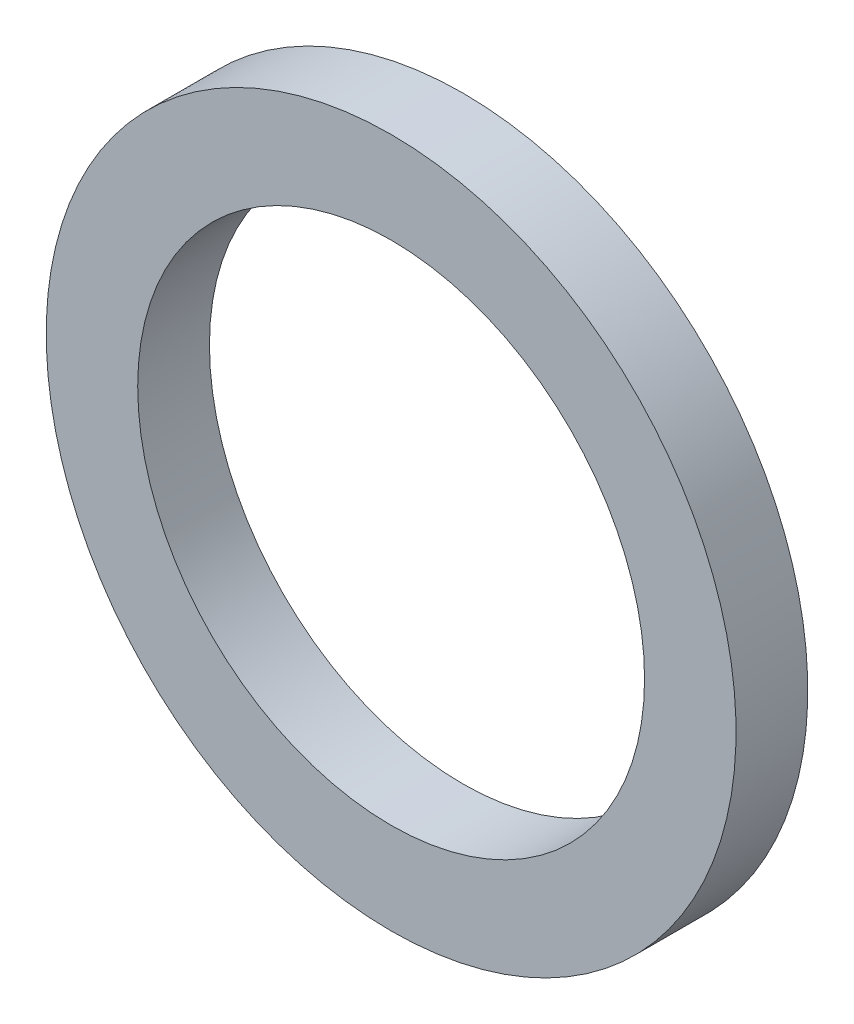
ISO-10303-21;
HEADER;
FILE_DESCRIPTION(('STEP AP214'),'2;1');
FILE_NAME('part.step','',(''),(''),'','','');
FILE_SCHEMA(('AUTOMOTIVE_DESIGN { 1 0 10303 214 1 1 1 1 }'));
ENDSEC;
DATA;
#1=APPLICATION_CONTEXT('core data for automotive mechanical design processes');
#2=APPLICATION_PROTOCOL_DEFINITION('international standard','automotive_design',2000,#1);
#3=PRODUCT_CONTEXT('',#1,'mechanical');
#4=PRODUCT('Part','Part','',(#3));
#5=PRODUCT_RELATED_PRODUCT_CATEGORY('part','',(#4));
#6=PRODUCT_DEFINITION_FORMATION('','',#4);
#7=PRODUCT_DEFINITION_CONTEXT('part definition',#1,'design');
#8=PRODUCT_DEFINITION('design','',#6,#7);
#9=PRODUCT_DEFINITION_SHAPE('','',#8);
#10=(LENGTH_UNIT() NAMED_UNIT(*) SI_UNIT(.MILLI.,.METRE.));
#11=(NAMED_UNIT(*) PLANE_ANGLE_UNIT() SI_UNIT($,.RADIAN.));
#12=(NAMED_UNIT(*) SI_UNIT($,.STERADIAN.) SOLID_ANGLE_UNIT());
#13=UNCERTAINTY_MEASURE_WITH_UNIT(LENGTH_MEASURE(1.E-05),#10,'distance_accuracy_value','');
#14=(GEOMETRIC_REPRESENTATION_CONTEXT(3) GLOBAL_UNCERTAINTY_ASSIGNED_CONTEXT((#13)) GLOBAL_UNIT_ASSIGNED_CONTEXT((#10,
#11,#12)) REPRESENTATION_CONTEXT('',''));
#15=CARTESIAN_POINT('',(0.,0.,0.));
#16=DIRECTION('',(0.,0.,1.));
#17=DIRECTION('',(1.,0.,0.));
#18=AXIS2_PLACEMENT_3D('',#15,#16,#17);
#19=CARTESIAN_POINT('',(0.,0.,2.4906));
#20=DIRECTION('',(0.,0.,-1.));
#21=DIRECTION('',(0.,1.,0.));
#22=AXIS2_PLACEMENT_3D('',#19,#20,#21);
#23=PLANE('',#22);
#24=CARTESIAN_POINT('',(0.,0.,2.4906));
#25=DIRECTION('',(0.,0.,1.));
#26=DIRECTION('',(0.,-1.,0.));
#27=AXIS2_PLACEMENT_3D('',#24,#25,#26);
#28=CIRCLE('',#27,3.125);
#29=CARTESIAN_POINT('',(0.,-3.125,2.4906));
#30=VERTEX_POINT('',#29);
#31=EDGE_CURVE('E26',#30,#30,#28,.T.);
#32=ORIENTED_EDGE('',*,*,#31,.F.);
#33=EDGE_LOOP('',(#32));
#34=FACE_BOUND('',#33,.T.);
#35=CARTESIAN_POINT('',(0.,0.,2.4906));
#36=DIRECTION('',(0.,0.,-1.));
#37=DIRECTION('',(0.,1.,0.));
#38=AXIS2_PLACEMENT_3D('',#35,#36,#37);
#39=CIRCLE('',#38,2.29616);
#40=CARTESIAN_POINT('',(0.,2.29616,2.4906));
#41=VERTEX_POINT('',#40);
#42=EDGE_CURVE('E35',#41,#41,#39,.F.);
#43=ORIENTED_EDGE('',*,*,#42,.T.);
#44=EDGE_LOOP('',(#43));
#45=FACE_BOUND('',#44,.T.);
#46=ADVANCED_FACE('F23',(#34,#45),#23,.T.);
#47=CARTESIAN_POINT('',(0.,0.,2.4906));
#48=DIRECTION('',(0.,0.,1.));
#49=DIRECTION('',(0.,-1.,0.));
#50=AXIS2_PLACEMENT_3D('',#47,#48,#49);
#51=CYLINDRICAL_SURFACE('',#50,3.125);
#52=CARTESIAN_POINT('',(0.,0.,3.1406));
#53=DIRECTION('',(0.,0.,1.));
#54=DIRECTION('',(0.,-1.,0.));
#55=AXIS2_PLACEMENT_3D('',#52,#53,#54);
#56=CIRCLE('',#55,3.125);
#57=CARTESIAN_POINT('',(0.,-3.125,3.1406));
#58=VERTEX_POINT('',#57);
#59=EDGE_CURVE('E30',#58,#58,#56,.F.);
#60=ORIENTED_EDGE('',*,*,#59,.T.);
#61=EDGE_LOOP('',(#60));
#62=FACE_BOUND('',#61,.T.);
#63=ORIENTED_EDGE('',*,*,#31,.T.);
#64=EDGE_LOOP('',(#63));
#65=FACE_BOUND('',#64,.T.);
#66=ADVANCED_FACE('F43',(#62,#65),#51,.T.);
#67=CARTESIAN_POINT('',(0.,0.,3.1406));
#68=DIRECTION('',(0.,0.,-1.));
#69=DIRECTION('',(0.,1.,0.));
#70=AXIS2_PLACEMENT_3D('',#67,#68,#69);
#71=CYLINDRICAL_SURFACE('',#70,2.29616);
#72=ORIENTED_EDGE('',*,*,#42,.F.);
#73=EDGE_LOOP('',(#72));
#74=FACE_BOUND('',#73,.T.);
#75=CARTESIAN_POINT('',(0.,0.,3.1406));
#76=DIRECTION('',(0.,0.,-1.));
#77=DIRECTION('',(0.,1.,0.));
#78=AXIS2_PLACEMENT_3D('',#75,#76,#77);
#79=CIRCLE('',#78,2.29616);
#80=CARTESIAN_POINT('',(0.,2.29616,3.1406));
#81=VERTEX_POINT('',#80);
#82=EDGE_CURVE('E12',#81,#81,#79,.F.);
#83=ORIENTED_EDGE('',*,*,#82,.T.);
#84=EDGE_LOOP('',(#83));
#85=FACE_BOUND('',#84,.T.);
#86=ADVANCED_FACE('F50',(#74,#85),#71,.F.);
#87=CARTESIAN_POINT('',(0.,0.,3.1406));
#88=DIRECTION('',(0.,0.,-1.));
#89=DIRECTION('',(0.,1.,0.));
#90=AXIS2_PLACEMENT_3D('',#87,#88,#89);
#91=PLANE('',#90);
#92=ORIENTED_EDGE('',*,*,#82,.F.);
#93=EDGE_LOOP('',(#92));
#94=FACE_BOUND('',#93,.T.);
#95=ORIENTED_EDGE('',*,*,#59,.F.);
#96=EDGE_LOOP('',(#95));
#97=FACE_BOUND('',#96,.T.);
#98=ADVANCED_FACE('F52',(#94,#97),#91,.F.);
#99=CLOSED_SHELL('',(#46,#66,#86,#98));
#100=MANIFOLD_SOLID_BREP('B1',#99);
#101=ADVANCED_BREP_SHAPE_REPRESENTATION('',(#18,#100),#14);
#102=SHAPE_DEFINITION_REPRESENTATION(#9,#101);
ENDSEC;
END-ISO-10303-21;
